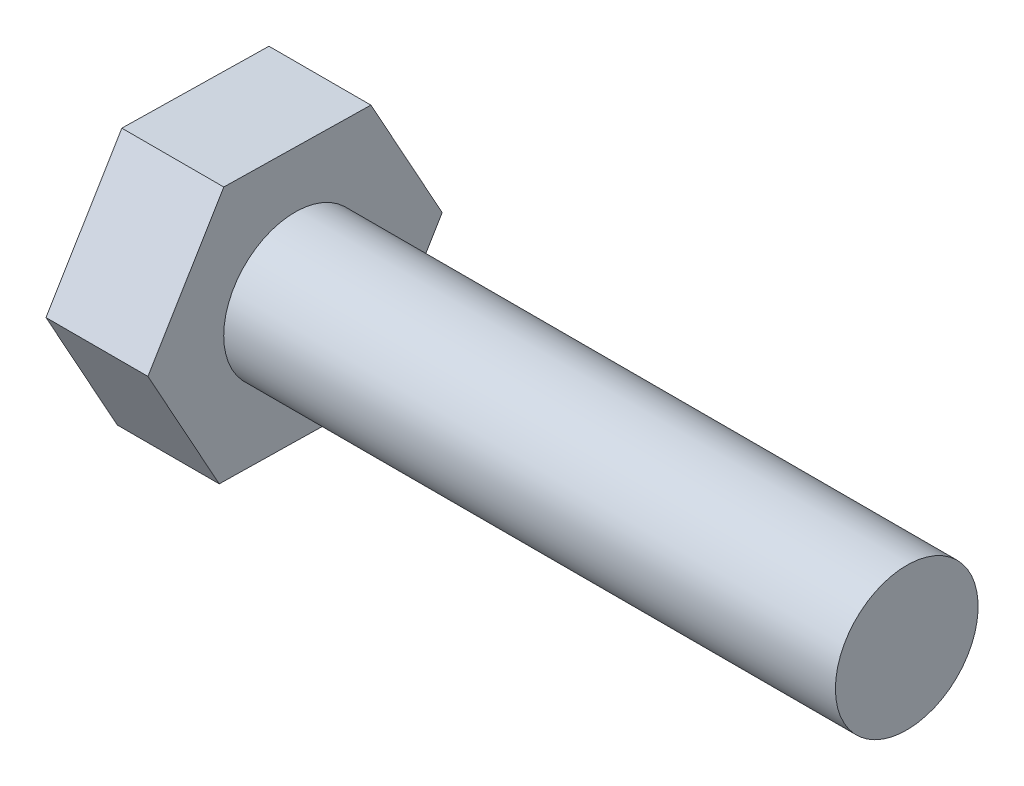
ISO-10303-21;
HEADER;
FILE_DESCRIPTION(('STEP AP214'),'2;1');
FILE_NAME('part.step','',(''),(''),'','','');
FILE_SCHEMA(('AUTOMOTIVE_DESIGN { 1 0 10303 214 1 1 1 1 }'));
ENDSEC;
DATA;
#1=APPLICATION_CONTEXT('core data for automotive mechanical design processes');
#2=APPLICATION_PROTOCOL_DEFINITION('international standard','automotive_design',2000,#1);
#3=PRODUCT_CONTEXT('',#1,'mechanical');
#4=PRODUCT('Part','Part','',(#3));
#5=PRODUCT_RELATED_PRODUCT_CATEGORY('part','',(#4));
#6=PRODUCT_DEFINITION_FORMATION('','',#4);
#7=PRODUCT_DEFINITION_CONTEXT('part definition',#1,'design');
#8=PRODUCT_DEFINITION('design','',#6,#7);
#9=PRODUCT_DEFINITION_SHAPE('','',#8);
#10=(LENGTH_UNIT() NAMED_UNIT(*) SI_UNIT(.MILLI.,.METRE.));
#11=(NAMED_UNIT(*) PLANE_ANGLE_UNIT() SI_UNIT($,.RADIAN.));
#12=(NAMED_UNIT(*) SI_UNIT($,.STERADIAN.) SOLID_ANGLE_UNIT());
#13=UNCERTAINTY_MEASURE_WITH_UNIT(LENGTH_MEASURE(1.E-05),#10,'distance_accuracy_value','');
#14=(GEOMETRIC_REPRESENTATION_CONTEXT(3) GLOBAL_UNCERTAINTY_ASSIGNED_CONTEXT((#13)) GLOBAL_UNIT_ASSIGNED_CONTEXT((#10,
#11,#12)) REPRESENTATION_CONTEXT('',''));
#15=CARTESIAN_POINT('',(0.,0.,0.));
#16=DIRECTION('',(0.,0.,1.));
#17=DIRECTION('',(1.,0.,0.));
#18=AXIS2_PLACEMENT_3D('',#15,#16,#17);
#19=CARTESIAN_POINT('',(-10.5999999999999,0.25690607701559,14.431470216195));
#20=DIRECTION('',(0.,-0.515335157468267,-0.856988725408425));
#21=DIRECTION('',(0.,0.856988725408425,-0.515335157468267));
#22=AXIS2_PLACEMENT_3D('',#19,#20,#21);
#23=PLANE('',#22);
#24=DIRECTION('',(0.,0.856988725408425,-0.515335157468267));
#25=VECTOR('',#24,1.);
#26=CARTESIAN_POINT('',(-0.59999999999992,0.256906077015562,14.431470216195));
#27=LINE('',#26,#25);
#28=CARTESIAN_POINT('',(-0.59999999999992,0.256906077015562,14.431470216195));
#29=VERTEX_POINT('',#28);
#30=CARTESIAN_POINT('',(-0.599999999999934,12.626472859691,6.99324791901532));
#31=VERTEX_POINT('',#30);
#32=EDGE_CURVE('E136',#29,#31,#27,.T.);
#33=ORIENTED_EDGE('',*,*,#32,.T.);
#34=DIRECTION('',(0.999999999999996,0.,0.));
#35=VECTOR('',#34,1.);
#36=CARTESIAN_POINT('',(-10.5999999999999,12.6264728596911,6.99324791901543));
#37=LINE('',#36,#35);
#38=CARTESIAN_POINT('',(-10.5999999999999,12.6264728596911,6.99324791901543));
#39=VERTEX_POINT('',#38);
#40=EDGE_CURVE('E163',#39,#31,#37,.T.);
#41=ORIENTED_EDGE('',*,*,#40,.F.);
#42=DIRECTION('',(0.,0.856988725408425,-0.515335157468267));
#43=VECTOR('',#42,1.);
#44=CARTESIAN_POINT('',(-10.5999999999999,0.25690607701559,14.431470216195));
#45=LINE('',#44,#43);
#46=CARTESIAN_POINT('',(-10.5999999999999,0.25690607701559,14.431470216195));
#47=VERTEX_POINT('',#46);
#48=EDGE_CURVE('E152',#47,#39,#45,.T.);
#49=ORIENTED_EDGE('',*,*,#48,.F.);
#50=DIRECTION('',(0.999999999999996,0.,0.));
#51=VECTOR('',#50,1.);
#52=CARTESIAN_POINT('',(-10.5999999999999,0.25690607701559,14.431470216195));
#53=LINE('',#52,#51);
#54=EDGE_CURVE('E132',#47,#29,#53,.T.);
#55=ORIENTED_EDGE('',*,*,#54,.T.);
#56=EDGE_LOOP('',(#33,#41,#49,#55));
#57=FACE_BOUND('',#56,.T.);
#58=ADVANCED_FACE('F44',(#57),#23,.F.);
#59=CARTESIAN_POINT('',(-10.5999999999999,12.6264728596911,6.99324791901543));
#60=DIRECTION('',(0.,-0.999841585694676,0.0177989751265599));
#61=DIRECTION('',(0.,-0.0177989751265601,-0.999841585694677));
#62=AXIS2_PLACEMENT_3D('',#59,#60,#61);
#63=PLANE('',#62);
#64=DIRECTION('',(0.,-0.0177989751265601,-0.999841585694677));
#65=VECTOR('',#64,1.);
#66=CARTESIAN_POINT('',(-0.599999999999934,12.626472859691,6.99324791901532));
#67=LINE('',#66,#65);
#68=CARTESIAN_POINT('',(-0.599999999999906,12.3695667826758,-7.4382222971798));
#69=VERTEX_POINT('',#68);
#70=EDGE_CURVE('E140',#31,#69,#67,.T.);
#71=ORIENTED_EDGE('',*,*,#70,.T.);
#72=DIRECTION('',(0.999999999999996,0.,0.));
#73=VECTOR('',#72,1.);
#74=CARTESIAN_POINT('',(-10.5999999999999,12.3695667826759,-7.43822229717972));
#75=LINE('',#74,#73);
#76=CARTESIAN_POINT('',(-10.5999999999999,12.3695667826759,-7.43822229717972));
#77=VERTEX_POINT('',#76);
#78=EDGE_CURVE('E159',#77,#69,#75,.T.);
#79=ORIENTED_EDGE('',*,*,#78,.F.);
#80=DIRECTION('',(0.,-0.0177989751265601,-0.999841585694677));
#81=VECTOR('',#80,1.);
#82=CARTESIAN_POINT('',(-10.5999999999999,12.6264728596911,6.99324791901543));
#83=LINE('',#82,#81);
#84=EDGE_CURVE('E100',#39,#77,#83,.T.);
#85=ORIENTED_EDGE('',*,*,#84,.F.);
#86=ORIENTED_EDGE('',*,*,#40,.T.);
#87=EDGE_LOOP('',(#71,#79,#85,#86));
#88=FACE_BOUND('',#87,.T.);
#89=ADVANCED_FACE('F191',(#88),#63,.F.);
#90=CARTESIAN_POINT('',(-10.5999999999999,12.3695667826759,-7.43822229717972));
#91=DIRECTION('',(0.,-0.48450642822641,0.874787700534985));
#92=DIRECTION('',(0.,-0.874787700534985,-0.484506428226409));
#93=AXIS2_PLACEMENT_3D('',#90,#91,#92);
#94=PLANE('',#93);
#95=DIRECTION('',(0.,-0.874787700534985,-0.484506428226409));
#96=VECTOR('',#95,1.);
#97=CARTESIAN_POINT('',(-0.599999999999906,12.3695667826758,-7.4382222971798));
#98=LINE('',#97,#96);
#99=CARTESIAN_POINT('',(-0.599999999999934,-0.256906077015367,-14.4314702161953));
#100=VERTEX_POINT('',#99);
#101=EDGE_CURVE('E143',#69,#100,#98,.T.);
#102=ORIENTED_EDGE('',*,*,#101,.T.);
#103=DIRECTION('',(0.999999999999996,0.,0.));
#104=VECTOR('',#103,1.);
#105=CARTESIAN_POINT('',(-10.5999999999999,-0.25690607701559,-14.4314702161952));
#106=LINE('',#105,#104);
#107=CARTESIAN_POINT('',(-10.5999999999999,-0.25690607701559,-14.4314702161952));
#108=VERTEX_POINT('',#107);
#109=EDGE_CURVE('E124',#108,#100,#106,.T.);
#110=ORIENTED_EDGE('',*,*,#109,.F.);
#111=DIRECTION('',(0.,-0.874787700534985,-0.484506428226409));
#112=VECTOR('',#111,1.);
#113=CARTESIAN_POINT('',(-10.5999999999999,12.3695667826759,-7.43822229717972));
#114=LINE('',#113,#112);
#115=EDGE_CURVE('E113',#77,#108,#114,.T.);
#116=ORIENTED_EDGE('',*,*,#115,.F.);
#117=ORIENTED_EDGE('',*,*,#78,.T.);
#118=EDGE_LOOP('',(#102,#110,#116,#117));
#119=FACE_BOUND('',#118,.T.);
#120=ADVANCED_FACE('F196',(#119),#94,.F.);
#121=CARTESIAN_POINT('',(-10.5999999999999,-0.25690607701559,-14.4314702161952));
#122=DIRECTION('',(0.,0.515335157468266,0.856988725408425));
#123=DIRECTION('',(0.,-0.856988725408425,0.515335157468266));
#124=AXIS2_PLACEMENT_3D('',#121,#122,#123);
#125=PLANE('',#124);
#126=DIRECTION('',(0.,-0.856988725408425,0.515335157468266));
#127=VECTOR('',#126,1.);
#128=CARTESIAN_POINT('',(-0.599999999999934,-0.256906077015367,-14.4314702161953));
#129=LINE('',#128,#127);
#130=CARTESIAN_POINT('',(-0.599999999999934,-12.6264728596911,-6.99324791901573));
#131=VERTEX_POINT('',#130);
#132=EDGE_CURVE('E122',#100,#131,#129,.T.);
#133=ORIENTED_EDGE('',*,*,#132,.T.);
#134=DIRECTION('',(0.999999999999996,0.,0.));
#135=VECTOR('',#134,1.);
#136=CARTESIAN_POINT('',(-10.5999999999999,-12.6264728596911,-6.99324791901559));
#137=LINE('',#136,#135);
#138=CARTESIAN_POINT('',(-10.5999999999999,-12.6264728596911,-6.99324791901559));
#139=VERTEX_POINT('',#138);
#140=EDGE_CURVE('E119',#139,#131,#137,.T.);
#141=ORIENTED_EDGE('',*,*,#140,.F.);
#142=DIRECTION('',(0.,-0.856988725408425,0.515335157468266));
#143=VECTOR('',#142,1.);
#144=CARTESIAN_POINT('',(-10.5999999999999,-0.25690607701559,-14.4314702161952));
#145=LINE('',#144,#143);
#146=EDGE_CURVE('E107',#108,#139,#145,.T.);
#147=ORIENTED_EDGE('',*,*,#146,.F.);
#148=ORIENTED_EDGE('',*,*,#109,.T.);
#149=EDGE_LOOP('',(#133,#141,#147,#148));
#150=FACE_BOUND('',#149,.T.);
#151=ADVANCED_FACE('F120',(#150),#125,.F.);
#152=CARTESIAN_POINT('',(-10.5999999999999,-12.6264728596911,-6.99324791901559));
#153=DIRECTION('',(0.,0.999841585694676,-0.0177989751265601));
#154=DIRECTION('',(0.,0.0177989751265603,0.999841585694676));
#155=AXIS2_PLACEMENT_3D('',#152,#153,#154);
#156=PLANE('',#155);
#157=DIRECTION('',(0.,0.0177989751265603,0.999841585694676));
#158=VECTOR('',#157,1.);
#159=CARTESIAN_POINT('',(-0.599999999999934,-12.6264728596911,-6.99324791901573));
#160=LINE('',#159,#158);
#161=CARTESIAN_POINT('',(-0.599999999999934,-12.3695667826758,7.43822229717936));
#162=VERTEX_POINT('',#161);
#163=EDGE_CURVE('E85',#131,#162,#160,.T.);
#164=ORIENTED_EDGE('',*,*,#163,.T.);
#165=DIRECTION('',(0.999999999999996,0.,0.));
#166=VECTOR('',#165,1.);
#167=CARTESIAN_POINT('',(-10.5999999999999,-12.3695667826757,7.43822229717919));
#168=LINE('',#167,#166);
#169=CARTESIAN_POINT('',(-10.5999999999999,-12.3695667826757,7.43822229717919));
#170=VERTEX_POINT('',#169);
#171=EDGE_CURVE('E125',#170,#162,#168,.T.);
#172=ORIENTED_EDGE('',*,*,#171,.F.);
#173=DIRECTION('',(0.,0.0177989751265603,0.999841585694676));
#174=VECTOR('',#173,1.);
#175=CARTESIAN_POINT('',(-10.5999999999999,-12.6264728596911,-6.99324791901559));
#176=LINE('',#175,#174);
#177=EDGE_CURVE('E111',#139,#170,#176,.T.);
#178=ORIENTED_EDGE('',*,*,#177,.F.);
#179=ORIENTED_EDGE('',*,*,#140,.T.);
#180=EDGE_LOOP('',(#164,#172,#178,#179));
#181=FACE_BOUND('',#180,.T.);
#182=ADVANCED_FACE('F127',(#181),#156,.F.);
#183=CARTESIAN_POINT('',(-10.5999999999999,-12.3695667826757,7.43822229717919));
#184=DIRECTION('',(0.,0.484506428226409,-0.874787700534984));
#185=DIRECTION('',(0.,0.874787700534985,0.48450642822641));
#186=AXIS2_PLACEMENT_3D('',#183,#184,#185);
#187=PLANE('',#186);
#188=DIRECTION('',(0.,0.874787700534985,0.48450642822641));
#189=VECTOR('',#188,1.);
#190=CARTESIAN_POINT('',(-0.599999999999934,-12.3695667826758,7.43822229717936));
#191=LINE('',#190,#189);
#192=EDGE_CURVE('E91',#162,#29,#191,.T.);
#193=ORIENTED_EDGE('',*,*,#192,.T.);
#194=ORIENTED_EDGE('',*,*,#54,.F.);
#195=DIRECTION('',(0.,0.874787700534985,0.48450642822641));
#196=VECTOR('',#195,1.);
#197=CARTESIAN_POINT('',(-10.5999999999999,-12.3695667826757,7.43822229717919));
#198=LINE('',#197,#196);
#199=EDGE_CURVE('E62',#170,#47,#198,.T.);
#200=ORIENTED_EDGE('',*,*,#199,.F.);
#201=ORIENTED_EDGE('',*,*,#171,.T.);
#202=EDGE_LOOP('',(#193,#194,#200,#201));
#203=FACE_BOUND('',#202,.T.);
#204=ADVANCED_FACE('F181',(#203),#187,.F.);
#205=CARTESIAN_POINT('',(-10.5999999999999,0.,-1.11022302462516E-13));
#206=DIRECTION('',(-0.999999999999996,0.,0.));
#207=DIRECTION('',(0.,0.,1.));
#208=AXIS2_PLACEMENT_3D('',#205,#206,#207);
#209=PLANE('',#208);
#210=ORIENTED_EDGE('',*,*,#48,.T.);
#211=ORIENTED_EDGE('',*,*,#84,.T.);
#212=ORIENTED_EDGE('',*,*,#115,.T.);
#213=ORIENTED_EDGE('',*,*,#146,.T.);
#214=ORIENTED_EDGE('',*,*,#177,.T.);
#215=ORIENTED_EDGE('',*,*,#199,.T.);
#216=EDGE_LOOP('',(#210,#211,#212,#213,#214,#215));
#217=FACE_BOUND('',#216,.T.);
#218=ADVANCED_FACE('F109',(#217),#209,.T.);
#219=CARTESIAN_POINT('',(59.3999999999997,3.05311331771918E-13,-1.66533453693773E-13));
#220=DIRECTION('',(-0.999999999999996,0.,0.));
#221=DIRECTION('',(0.,0.,1.));
#222=AXIS2_PLACEMENT_3D('',#219,#220,#221);
#223=CYLINDRICAL_SURFACE('',#222,7.);
#224=CARTESIAN_POINT('',(59.3999999999997,3.05311331771918E-13,-1.66533453693773E-13));
#225=DIRECTION('',(0.999999999999996,0.,0.));
#226=DIRECTION('',(0.,0.,-1.));
#227=AXIS2_PLACEMENT_3D('',#224,#225,#226);
#228=CIRCLE('',#227,7.);
#229=CARTESIAN_POINT('',(59.3999999999997,3.05311331771918E-13,6.99999999999983));
#230=VERTEX_POINT('',#229);
#231=EDGE_CURVE('E11',#230,#230,#228,.T.);
#232=CARTESIAN_POINT('',(-0.599999999999934,1.11022302462516E-13,-2.4980018054066E-13));
#233=DIRECTION('',(0.999999999999996,0.,0.));
#234=DIRECTION('',(0.,0.,-1.));
#235=AXIS2_PLACEMENT_3D('',#232,#233,#234);
#236=CIRCLE('',#235,7.);
#237=CARTESIAN_POINT('',(-0.599999999999934,2.85327317328665E-13,6.99999999999984));
#238=VERTEX_POINT('',#237);
#239=EDGE_CURVE('E48',#238,#238,#236,.T.);
#240=CARTESIAN_POINT('',(59.3999999999997,3.05311331771918E-13,6.99999999999983));
#241=CARTESIAN_POINT('',(58.7749999999997,3.05103164954801E-13,6.99999999999983));
#242=CARTESIAN_POINT('',(58.1499999999997,3.04894998137684E-13,6.99999999999983));
#243=CARTESIAN_POINT('',(56.8999999999997,3.04478664503449E-13,6.99999999999983));
#244=CARTESIAN_POINT('',(56.2749999999997,3.04270497686332E-13,6.99999999999983));
#245=CARTESIAN_POINT('',(55.0249999999997,3.03854164052098E-13,6.99999999999983));
#246=CARTESIAN_POINT('',(54.3999999999997,3.0364599723498E-13,6.99999999999983));
#247=CARTESIAN_POINT('',(53.1499999999997,3.03229663600746E-13,6.99999999999983));
#248=CARTESIAN_POINT('',(52.5249999999997,3.03021496783629E-13,6.99999999999983));
#249=CARTESIAN_POINT('',(51.2749999999997,3.02605163149394E-13,6.99999999999983));
#250=CARTESIAN_POINT('',(50.6499999999997,3.02396996332277E-13,6.99999999999983));
#251=CARTESIAN_POINT('',(49.3999999999997,3.01980662698043E-13,6.99999999999983));
#252=CARTESIAN_POINT('',(48.7749999999997,3.01772495880925E-13,6.99999999999983));
#253=CARTESIAN_POINT('',(47.5249999999997,3.01356162246691E-13,6.99999999999983));
#254=CARTESIAN_POINT('',(46.8999999999997,3.01147995429574E-13,6.99999999999983));
#255=CARTESIAN_POINT('',(45.6499999999997,3.00731661795339E-13,6.99999999999983));
#256=CARTESIAN_POINT('',(45.0249999999997,3.00523494978222E-13,6.99999999999983));
#257=CARTESIAN_POINT('',(43.7749999999998,3.00107161343988E-13,6.99999999999983));
#258=CARTESIAN_POINT('',(43.1499999999998,2.9989899452687E-13,6.99999999999983));
#259=CARTESIAN_POINT('',(41.8999999999998,2.99482660892636E-13,6.99999999999983));
#260=CARTESIAN_POINT('',(41.2749999999998,2.99274494075519E-13,6.99999999999983));
#261=CARTESIAN_POINT('',(40.0249999999998,2.98858160441284E-13,6.99999999999983));
#262=CARTESIAN_POINT('',(39.3999999999998,2.98649993624167E-13,6.99999999999983));
#263=CARTESIAN_POINT('',(38.1499999999998,2.98233659989933E-13,6.99999999999983));
#264=CARTESIAN_POINT('',(37.5249999999998,2.98025493172815E-13,6.99999999999983));
#265=CARTESIAN_POINT('',(36.2749999999998,2.97609159538581E-13,6.99999999999983));
#266=CARTESIAN_POINT('',(35.6499999999998,2.97400992721464E-13,6.99999999999984));
#267=CARTESIAN_POINT('',(34.3999999999998,2.96984659087229E-13,6.99999999999984));
#268=CARTESIAN_POINT('',(33.7749999999998,2.96776492270112E-13,6.99999999999984));
#269=CARTESIAN_POINT('',(32.5249999999998,2.96360158635878E-13,6.99999999999984));
#270=CARTESIAN_POINT('',(31.8999999999998,2.96151991818761E-13,6.99999999999984));
#271=CARTESIAN_POINT('',(30.6499999999998,2.95735658184526E-13,6.99999999999984));
#272=CARTESIAN_POINT('',(30.0249999999999,2.95527491367409E-13,6.99999999999984));
#273=CARTESIAN_POINT('',(28.7749999999999,2.95111157733174E-13,6.99999999999984));
#274=CARTESIAN_POINT('',(28.1499999999999,2.94902990916057E-13,6.99999999999984));
#275=CARTESIAN_POINT('',(26.8999999999999,2.94486657281823E-13,6.99999999999984));
#276=CARTESIAN_POINT('',(26.2749999999999,2.94278490464706E-13,6.99999999999984));
#277=CARTESIAN_POINT('',(25.0249999999999,2.93862156830471E-13,6.99999999999984));
#278=CARTESIAN_POINT('',(24.3999999999999,2.93653990013354E-13,6.99999999999984));
#279=CARTESIAN_POINT('',(23.1499999999999,2.9323765637912E-13,6.99999999999984));
#280=CARTESIAN_POINT('',(22.5249999999999,2.93029489562002E-13,6.99999999999984));
#281=CARTESIAN_POINT('',(21.2749999999999,2.92613155927768E-13,6.99999999999984));
#282=CARTESIAN_POINT('',(20.6499999999999,2.92404989110651E-13,6.99999999999984));
#283=CARTESIAN_POINT('',(19.3999999999999,2.91988655476416E-13,6.99999999999984));
#284=CARTESIAN_POINT('',(18.7749999999999,2.91780488659299E-13,6.99999999999984));
#285=CARTESIAN_POINT('',(17.5249999999999,2.91364155025065E-13,6.99999999999984));
#286=CARTESIAN_POINT('',(16.8999999999999,2.91155988207947E-13,6.99999999999984));
#287=CARTESIAN_POINT('',(15.65,2.90739654573713E-13,6.99999999999984));
#288=CARTESIAN_POINT('',(15.025,2.90531487756596E-13,6.99999999999984));
#289=CARTESIAN_POINT('',(13.775,2.90115154122361E-13,6.99999999999984));
#290=CARTESIAN_POINT('',(13.15,2.89906987305244E-13,6.99999999999984));
#291=CARTESIAN_POINT('',(11.9,2.8949065367101E-13,6.99999999999984));
#292=CARTESIAN_POINT('',(11.275,2.89282486853892E-13,6.99999999999984));
#293=CARTESIAN_POINT('',(10.025,2.88866153219658E-13,6.99999999999984));
#294=CARTESIAN_POINT('',(9.4,2.88657986402541E-13,6.99999999999984));
#295=CARTESIAN_POINT('',(8.15,2.88241652768306E-13,6.99999999999984));
#296=CARTESIAN_POINT('',(7.52500000000001,2.88033485951189E-13,6.99999999999984));
#297=CARTESIAN_POINT('',(6.27500000000002,2.87617152316955E-13,6.99999999999984));
#298=CARTESIAN_POINT('',(5.65000000000003,2.87408985499837E-13,6.99999999999984));
#299=CARTESIAN_POINT('',(4.40000000000003,2.86992651865603E-13,6.99999999999984));
#300=CARTESIAN_POINT('',(3.77500000000004,2.86784485048486E-13,6.99999999999984));
#301=CARTESIAN_POINT('',(2.52500000000005,2.86368151414251E-13,6.99999999999984));
#302=CARTESIAN_POINT('',(1.90000000000005,2.86159984597134E-13,6.99999999999984));
#303=CARTESIAN_POINT('',(0.650000000000058,2.857436509629E-13,6.99999999999984));
#304=CARTESIAN_POINT('',(0.0250000000000619,2.85535484145783E-13,6.99999999999984));
#305=CARTESIAN_POINT('',(-0.599999999999934,2.85327317328665E-13,6.99999999999984));
#306=B_SPLINE_CURVE_WITH_KNOTS('',3,(#240,#241,#242,#243,#244,#245,#246,#247,#248,#249,#250,
#251,#252,#253,#254,#255,#256,#257,#258,#259,#260,#261,#262,#263,#264,#265,#266,#267,#268,#269,
#270,#271,#272,#273,#274,#275,#276,#277,#278,#279,#280,#281,#282,#283,#284,#285,#286,#287,#288,
#289,#290,#291,#292,#293,#294,#295,#296,#297,#298,#299,#300,#301,#302,#303,#304,#305),
.UNSPECIFIED.,.F.,.F.,(4,2,2,2,2,2,2,2,2,2,2,2,2,2,2,2,2,2,2,2,2,2,2,2,2,2,2,2,2,2,2,2,4),(0.,
1.87499999999999,3.74999999999998,5.62499999999996,7.49999999999995,9.37499999999994,
11.2499999999999,13.1249999999999,14.9999999999999,16.8749999999999,18.7499999999999,
20.6249999999999,22.4999999999998,24.3749999999998,26.2499999999998,28.1249999999998,
29.9999999999998,31.8749999999998,33.7499999999998,35.6249999999998,37.4999999999997,
39.3749999999997,41.2499999999997,43.1249999999997,44.9999999999997,46.8749999999997,
48.7499999999997,50.6249999999997,52.4999999999996,54.3749999999996,56.2499999999996,
58.1249999999996,59.9999999999996),.UNSPECIFIED.);
#307=EDGE_CURVE('BSEAM172',#230,#238,#306,.T.);
#308=ORIENTED_EDGE('',*,*,#231,.F.);
#309=ORIENTED_EDGE('',*,*,#239,.T.);
#310=ORIENTED_EDGE('',*,*,#307,.T.);
#311=ORIENTED_EDGE('',*,*,#307,.F.);
#312=EDGE_LOOP('',(#308,#310,#309,#311));
#313=FACE_BOUND('',#312,.T.);
#314=ADVANCED_FACE('F172',(#313),#223,.T.);
#315=CARTESIAN_POINT('',(59.3999999999997,3.05311331771918E-13,-1.66533453693773E-13));
#316=DIRECTION('',(0.999999999999996,0.,0.));
#317=DIRECTION('',(0.,0.,-1.));
#318=AXIS2_PLACEMENT_3D('',#315,#316,#317);
#319=PLANE('',#318);
#320=ORIENTED_EDGE('',*,*,#231,.T.);
#321=EDGE_LOOP('',(#320));
#322=FACE_BOUND('',#321,.T.);
#323=ADVANCED_FACE('F176',(#322),#319,.T.);
#324=CARTESIAN_POINT('',(-0.59999999999992,7.5055534994653,-2.22044604925031E-13));
#325=DIRECTION('',(-0.999999999999996,0.,0.));
#326=DIRECTION('',(0.,0.,1.));
#327=AXIS2_PLACEMENT_3D('',#324,#325,#326);
#328=PLANE('',#327);
#329=ORIENTED_EDGE('',*,*,#239,.F.);
#330=EDGE_LOOP('',(#329));
#331=FACE_BOUND('',#330,.T.);
#332=ORIENTED_EDGE('',*,*,#32,.F.);
#333=ORIENTED_EDGE('',*,*,#192,.F.);
#334=ORIENTED_EDGE('',*,*,#163,.F.);
#335=ORIENTED_EDGE('',*,*,#132,.F.);
#336=ORIENTED_EDGE('',*,*,#101,.F.);
#337=ORIENTED_EDGE('',*,*,#70,.F.);
#338=EDGE_LOOP('',(#332,#333,#334,#335,#336,#337));
#339=FACE_BOUND('',#338,.T.);
#340=ADVANCED_FACE('F46',(#331,#339),#328,.F.);
#341=CLOSED_SHELL('',(#58,#89,#120,#151,#182,#204,#218,#314,#323,#340));
#342=MANIFOLD_SOLID_BREP('B2',#341);
#343=ADVANCED_BREP_SHAPE_REPRESENTATION('',(#18,#342),#14);
#344=SHAPE_DEFINITION_REPRESENTATION(#9,#343);
ENDSEC;
END-ISO-10303-21;
